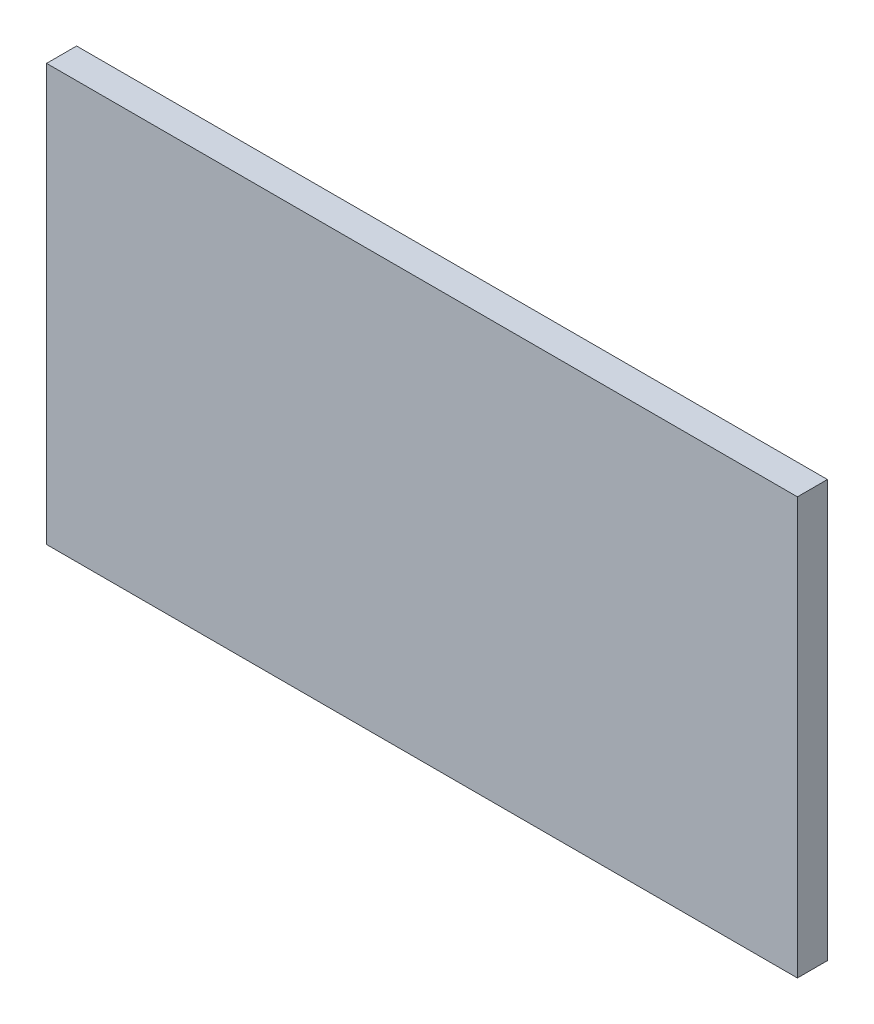
ISO-10303-21;
HEADER;
FILE_DESCRIPTION(('STEP AP214'),'2;1');
FILE_NAME('part.step','',(''),(''),'','','');
FILE_SCHEMA(('AUTOMOTIVE_DESIGN { 1 0 10303 214 1 1 1 1 }'));
ENDSEC;
DATA;
#1=APPLICATION_CONTEXT('core data for automotive mechanical design processes');
#2=APPLICATION_PROTOCOL_DEFINITION('international standard','automotive_design',2000,#1);
#3=PRODUCT_CONTEXT('',#1,'mechanical');
#4=PRODUCT('Part','Part','',(#3));
#5=PRODUCT_RELATED_PRODUCT_CATEGORY('part','',(#4));
#6=PRODUCT_DEFINITION_FORMATION('','',#4);
#7=PRODUCT_DEFINITION_CONTEXT('part definition',#1,'design');
#8=PRODUCT_DEFINITION('design','',#6,#7);
#9=PRODUCT_DEFINITION_SHAPE('','',#8);
#10=(LENGTH_UNIT() NAMED_UNIT(*) SI_UNIT(.MILLI.,.METRE.));
#11=(NAMED_UNIT(*) PLANE_ANGLE_UNIT() SI_UNIT($,.RADIAN.));
#12=(NAMED_UNIT(*) SI_UNIT($,.STERADIAN.) SOLID_ANGLE_UNIT());
#13=UNCERTAINTY_MEASURE_WITH_UNIT(LENGTH_MEASURE(1.E-05),#10,'distance_accuracy_value','');
#14=(GEOMETRIC_REPRESENTATION_CONTEXT(3) GLOBAL_UNCERTAINTY_ASSIGNED_CONTEXT((#13)) GLOBAL_UNIT_ASSIGNED_CONTEXT((#10,
#11,#12)) REPRESENTATION_CONTEXT('',''));
#15=CARTESIAN_POINT('',(0.,0.,0.));
#16=DIRECTION('',(0.,0.,1.));
#17=DIRECTION('',(1.,0.,0.));
#18=AXIS2_PLACEMENT_3D('',#15,#16,#17);
#19=CARTESIAN_POINT('',(-499.999999999993,4.9999999999891,40.));
#20=DIRECTION('',(0.,1.,0.));
#21=DIRECTION('',(0.,0.,1.));
#22=AXIS2_PLACEMENT_3D('',#19,#20,#21);
#23=PLANE('',#22);
#24=DIRECTION('',(1.,0.,0.));
#25=VECTOR('',#24,1.);
#26=CARTESIAN_POINT('',(-499.999999999993,4.9999999999891,0.));
#27=LINE('',#26,#25);
#28=CARTESIAN_POINT('',(-499.999999999993,4.9999999999891,0.));
#29=VERTEX_POINT('',#28);
#30=CARTESIAN_POINT('',(499.999999999993,4.9999999999891,0.));
#31=VERTEX_POINT('',#30);
#32=EDGE_CURVE('E108',#29,#31,#27,.T.);
#33=ORIENTED_EDGE('',*,*,#32,.F.);
#34=DIRECTION('',(0.,0.,-1.));
#35=VECTOR('',#34,1.);
#36=CARTESIAN_POINT('',(-499.999999999993,4.9999999999891,40.));
#37=LINE('',#36,#35);
#38=CARTESIAN_POINT('',(-499.999999999993,4.9999999999891,40.));
#39=VERTEX_POINT('',#38);
#40=EDGE_CURVE('E11',#39,#29,#37,.T.);
#41=ORIENTED_EDGE('',*,*,#40,.F.);
#42=DIRECTION('',(1.,0.,0.));
#43=VECTOR('',#42,1.);
#44=CARTESIAN_POINT('',(-499.999999999993,4.9999999999891,40.));
#45=LINE('',#44,#43);
#46=CARTESIAN_POINT('',(499.999999999993,4.9999999999891,40.));
#47=VERTEX_POINT('',#46);
#48=EDGE_CURVE('E103',#39,#47,#45,.T.);
#49=ORIENTED_EDGE('',*,*,#48,.T.);
#50=DIRECTION('',(0.,0.,-1.));
#51=VECTOR('',#50,1.);
#52=CARTESIAN_POINT('',(499.999999999993,4.9999999999891,40.));
#53=LINE('',#52,#51);
#54=EDGE_CURVE('E46',#47,#31,#53,.T.);
#55=ORIENTED_EDGE('',*,*,#54,.T.);
#56=EDGE_LOOP('',(#33,#41,#49,#55));
#57=FACE_BOUND('',#56,.T.);
#58=ADVANCED_FACE('F43',(#57),#23,.T.);
#59=CARTESIAN_POINT('',(-499.999999999993,4.9999999999891,40.));
#60=DIRECTION('',(1.,0.,0.));
#61=DIRECTION('',(0.,1.,0.));
#62=AXIS2_PLACEMENT_3D('',#59,#60,#61);
#63=PLANE('',#62);
#64=DIRECTION('',(0.,-1.,0.));
#65=VECTOR('',#64,1.);
#66=CARTESIAN_POINT('',(-499.999999999993,4.9999999999891,0.));
#67=LINE('',#66,#65);
#68=CARTESIAN_POINT('',(-499.999999999993,-550.000000000008,0.));
#69=VERTEX_POINT('',#68);
#70=EDGE_CURVE('E76',#29,#69,#67,.T.);
#71=ORIENTED_EDGE('',*,*,#70,.T.);
#72=DIRECTION('',(0.,0.,-1.));
#73=VECTOR('',#72,1.);
#74=CARTESIAN_POINT('',(-499.999999999993,-550.000000000008,40.));
#75=LINE('',#74,#73);
#76=CARTESIAN_POINT('',(-499.999999999993,-550.000000000008,40.));
#77=VERTEX_POINT('',#76);
#78=EDGE_CURVE('E52',#77,#69,#75,.T.);
#79=ORIENTED_EDGE('',*,*,#78,.F.);
#80=DIRECTION('',(0.,-1.,0.));
#81=VECTOR('',#80,1.);
#82=CARTESIAN_POINT('',(-499.999999999993,4.9999999999891,40.));
#83=LINE('',#82,#81);
#84=EDGE_CURVE('E93',#39,#77,#83,.T.);
#85=ORIENTED_EDGE('',*,*,#84,.F.);
#86=ORIENTED_EDGE('',*,*,#40,.T.);
#87=EDGE_LOOP('',(#71,#79,#85,#86));
#88=FACE_BOUND('',#87,.T.);
#89=ADVANCED_FACE('F118',(#88),#63,.F.);
#90=CARTESIAN_POINT('',(-499.999999999993,-550.000000000008,40.));
#91=DIRECTION('',(0.,1.,0.));
#92=DIRECTION('',(0.,0.,1.));
#93=AXIS2_PLACEMENT_3D('',#90,#91,#92);
#94=PLANE('',#93);
#95=DIRECTION('',(1.,0.,0.));
#96=VECTOR('',#95,1.);
#97=CARTESIAN_POINT('',(-499.999999999993,-550.000000000008,0.));
#98=LINE('',#97,#96);
#99=CARTESIAN_POINT('',(499.999999999993,-550.000000000008,0.));
#100=VERTEX_POINT('',#99);
#101=EDGE_CURVE('E100',#69,#100,#98,.T.);
#102=ORIENTED_EDGE('',*,*,#101,.T.);
#103=DIRECTION('',(0.,0.,-1.));
#104=VECTOR('',#103,1.);
#105=CARTESIAN_POINT('',(499.999999999993,-550.000000000008,40.));
#106=LINE('',#105,#104);
#107=CARTESIAN_POINT('',(499.999999999993,-550.000000000008,40.));
#108=VERTEX_POINT('',#107);
#109=EDGE_CURVE('E97',#108,#100,#106,.T.);
#110=ORIENTED_EDGE('',*,*,#109,.F.);
#111=DIRECTION('',(1.,0.,0.));
#112=VECTOR('',#111,1.);
#113=CARTESIAN_POINT('',(-499.999999999993,-550.000000000008,40.));
#114=LINE('',#113,#112);
#115=EDGE_CURVE('E88',#77,#108,#114,.T.);
#116=ORIENTED_EDGE('',*,*,#115,.F.);
#117=ORIENTED_EDGE('',*,*,#78,.T.);
#118=EDGE_LOOP('',(#102,#110,#116,#117));
#119=FACE_BOUND('',#118,.T.);
#120=ADVANCED_FACE('F98',(#119),#94,.F.);
#121=CARTESIAN_POINT('',(499.999999999993,4.9999999999891,40.));
#122=DIRECTION('',(1.,0.,0.));
#123=DIRECTION('',(0.,1.,0.));
#124=AXIS2_PLACEMENT_3D('',#121,#122,#123);
#125=PLANE('',#124);
#126=DIRECTION('',(0.,-1.,0.));
#127=VECTOR('',#126,1.);
#128=CARTESIAN_POINT('',(499.999999999993,4.9999999999891,0.));
#129=LINE('',#128,#127);
#130=EDGE_CURVE('E111',#31,#100,#129,.T.);
#131=ORIENTED_EDGE('',*,*,#130,.F.);
#132=ORIENTED_EDGE('',*,*,#54,.F.);
#133=DIRECTION('',(0.,-1.,0.));
#134=VECTOR('',#133,1.);
#135=CARTESIAN_POINT('',(499.999999999993,4.9999999999891,40.));
#136=LINE('',#135,#134);
#137=EDGE_CURVE('E92',#47,#108,#136,.T.);
#138=ORIENTED_EDGE('',*,*,#137,.T.);
#139=ORIENTED_EDGE('',*,*,#109,.T.);
#140=EDGE_LOOP('',(#131,#132,#138,#139));
#141=FACE_BOUND('',#140,.T.);
#142=ADVANCED_FACE('F102',(#141),#125,.T.);
#143=CARTESIAN_POINT('',(0.,0.,40.));
#144=DIRECTION('',(0.,0.,-1.));
#145=DIRECTION('',(-1.,0.,0.));
#146=AXIS2_PLACEMENT_3D('',#143,#144,#145);
#147=PLANE('',#146);
#148=ORIENTED_EDGE('',*,*,#48,.F.);
#149=ORIENTED_EDGE('',*,*,#84,.T.);
#150=ORIENTED_EDGE('',*,*,#115,.T.);
#151=ORIENTED_EDGE('',*,*,#137,.F.);
#152=EDGE_LOOP('',(#148,#149,#150,#151));
#153=FACE_BOUND('',#152,.T.);
#154=ADVANCED_FACE('F91',(#153),#147,.F.);
#155=CARTESIAN_POINT('',(0.,0.,0.));
#156=DIRECTION('',(0.,0.,-1.));
#157=DIRECTION('',(-1.,0.,0.));
#158=AXIS2_PLACEMENT_3D('',#155,#156,#157);
#159=PLANE('',#158);
#160=ORIENTED_EDGE('',*,*,#32,.T.);
#161=ORIENTED_EDGE('',*,*,#130,.T.);
#162=ORIENTED_EDGE('',*,*,#101,.F.);
#163=ORIENTED_EDGE('',*,*,#70,.F.);
#164=EDGE_LOOP('',(#160,#161,#162,#163));
#165=FACE_BOUND('',#164,.T.);
#166=ADVANCED_FACE('F116',(#165),#159,.T.);
#167=CLOSED_SHELL('',(#58,#89,#120,#142,#154,#166));
#168=MANIFOLD_SOLID_BREP('B2',#167);
#169=ADVANCED_BREP_SHAPE_REPRESENTATION('',(#18,#168),#14);
#170=SHAPE_DEFINITION_REPRESENTATION(#9,#169);
ENDSEC;
END-ISO-10303-21;
